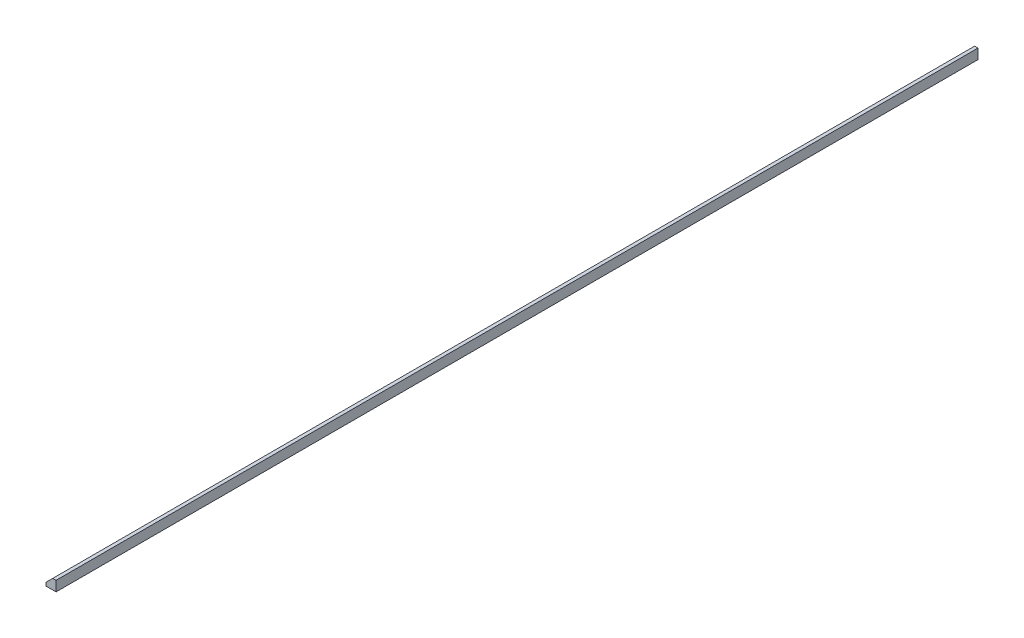
ISO-10303-21;
HEADER;
FILE_DESCRIPTION(('STEP AP214'),'2;1');
FILE_NAME('part.step','',(''),(''),'','','');
FILE_SCHEMA(('AUTOMOTIVE_DESIGN { 1 0 10303 214 1 1 1 1 }'));
ENDSEC;
DATA;
#1=APPLICATION_CONTEXT('core data for automotive mechanical design processes');
#2=APPLICATION_PROTOCOL_DEFINITION('international standard','automotive_design',2000,#1);
#3=PRODUCT_CONTEXT('',#1,'mechanical');
#4=PRODUCT('Part','Part','',(#3));
#5=PRODUCT_RELATED_PRODUCT_CATEGORY('part','',(#4));
#6=PRODUCT_DEFINITION_FORMATION('','',#4);
#7=PRODUCT_DEFINITION_CONTEXT('part definition',#1,'design');
#8=PRODUCT_DEFINITION('design','',#6,#7);
#9=PRODUCT_DEFINITION_SHAPE('','',#8);
#10=(LENGTH_UNIT() NAMED_UNIT(*) SI_UNIT(.MILLI.,.METRE.));
#11=(NAMED_UNIT(*) PLANE_ANGLE_UNIT() SI_UNIT($,.RADIAN.));
#12=(NAMED_UNIT(*) SI_UNIT($,.STERADIAN.) SOLID_ANGLE_UNIT());
#13=UNCERTAINTY_MEASURE_WITH_UNIT(LENGTH_MEASURE(1.E-05),#10,'distance_accuracy_value','');
#14=(GEOMETRIC_REPRESENTATION_CONTEXT(3) GLOBAL_UNCERTAINTY_ASSIGNED_CONTEXT((#13)) GLOBAL_UNIT_ASSIGNED_CONTEXT((#10,
#11,#12)) REPRESENTATION_CONTEXT('',''));
#15=CARTESIAN_POINT('',(0.,0.,0.));
#16=DIRECTION('',(0.,0.,1.));
#17=DIRECTION('',(1.,0.,0.));
#18=AXIS2_PLACEMENT_3D('',#15,#16,#17);
#19=CARTESIAN_POINT('',(0.,0.,1100.));
#20=DIRECTION('',(1.,0.,0.));
#21=DIRECTION('',(0.,0.,-1.));
#22=AXIS2_PLACEMENT_3D('',#19,#20,#21);
#23=PLANE('',#22);
#24=DIRECTION('',(0.,-1.,0.));
#25=VECTOR('',#24,1.);
#26=CARTESIAN_POINT('',(0.,0.,1100.));
#27=LINE('',#26,#25);
#28=CARTESIAN_POINT('',(0.,3.99999999999999,1100.));
#29=VERTEX_POINT('',#28);
#30=CARTESIAN_POINT('',(0.,0.,1100.));
#31=VERTEX_POINT('',#30);
#32=EDGE_CURVE('E79',#29,#31,#27,.T.);
#33=ORIENTED_EDGE('',*,*,#32,.F.);
#34=DIRECTION('',(0.,0.,-1.));
#35=VECTOR('',#34,1.);
#36=CARTESIAN_POINT('',(0.,3.99999999999999,1100.));
#37=LINE('',#36,#35);
#38=CARTESIAN_POINT('',(0.,3.99999999999999,0.));
#39=VERTEX_POINT('',#38);
#40=EDGE_CURVE('E102',#29,#39,#37,.T.);
#41=ORIENTED_EDGE('',*,*,#40,.T.);
#42=DIRECTION('',(0.,-1.,0.));
#43=VECTOR('',#42,1.);
#44=CARTESIAN_POINT('',(0.,0.,0.));
#45=LINE('',#44,#43);
#46=CARTESIAN_POINT('',(0.,0.,0.));
#47=VERTEX_POINT('',#46);
#48=EDGE_CURVE('E100',#39,#47,#45,.T.);
#49=ORIENTED_EDGE('',*,*,#48,.T.);
#50=DIRECTION('',(0.,0.,-1.));
#51=VECTOR('',#50,1.);
#52=CARTESIAN_POINT('',(0.,0.,1100.));
#53=LINE('',#52,#51);
#54=EDGE_CURVE('E94',#31,#47,#53,.T.);
#55=ORIENTED_EDGE('',*,*,#54,.F.);
#56=EDGE_LOOP('',(#33,#41,#49,#55));
#57=FACE_BOUND('',#56,.T.);
#58=ADVANCED_FACE('F33',(#57),#23,.F.);
#59=CARTESIAN_POINT('',(0.,0.,1100.));
#60=DIRECTION('',(0.,1.,0.));
#61=DIRECTION('',(0.,0.,1.));
#62=AXIS2_PLACEMENT_3D('',#59,#60,#61);
#63=PLANE('',#62);
#64=DIRECTION('',(1.,0.,0.));
#65=VECTOR('',#64,1.);
#66=CARTESIAN_POINT('',(0.,0.,0.));
#67=LINE('',#66,#65);
#68=CARTESIAN_POINT('',(12.,0.,0.));
#69=VERTEX_POINT('',#68);
#70=EDGE_CURVE('E115',#47,#69,#67,.T.);
#71=ORIENTED_EDGE('',*,*,#70,.T.);
#72=DIRECTION('',(0.,0.,-1.));
#73=VECTOR('',#72,1.);
#74=CARTESIAN_POINT('',(12.,0.,1100.));
#75=LINE('',#74,#73);
#76=CARTESIAN_POINT('',(12.,0.,1100.));
#77=VERTEX_POINT('',#76);
#78=EDGE_CURVE('E96',#77,#69,#75,.T.);
#79=ORIENTED_EDGE('',*,*,#78,.F.);
#80=DIRECTION('',(1.,0.,0.));
#81=VECTOR('',#80,1.);
#82=CARTESIAN_POINT('',(0.,0.,1100.));
#83=LINE('',#82,#81);
#84=EDGE_CURVE('E82',#31,#77,#83,.T.);
#85=ORIENTED_EDGE('',*,*,#84,.F.);
#86=ORIENTED_EDGE('',*,*,#54,.T.);
#87=EDGE_LOOP('',(#71,#79,#85,#86));
#88=FACE_BOUND('',#87,.T.);
#89=ADVANCED_FACE('F93',(#88),#63,.F.);
#90=CARTESIAN_POINT('',(12.,0.,1100.));
#91=DIRECTION('',(-1.,0.,0.));
#92=DIRECTION('',(0.,0.,1.));
#93=AXIS2_PLACEMENT_3D('',#90,#91,#92);
#94=PLANE('',#93);
#95=DIRECTION('',(0.,1.,0.));
#96=VECTOR('',#95,1.);
#97=CARTESIAN_POINT('',(12.,0.,0.));
#98=LINE('',#97,#96);
#99=CARTESIAN_POINT('',(12.,12.,0.));
#100=VERTEX_POINT('',#99);
#101=EDGE_CURVE('E113',#69,#100,#98,.T.);
#102=ORIENTED_EDGE('',*,*,#101,.T.);
#103=DIRECTION('',(0.,0.,-1.));
#104=VECTOR('',#103,1.);
#105=CARTESIAN_POINT('',(12.,12.,1100.));
#106=LINE('',#105,#104);
#107=CARTESIAN_POINT('',(12.,12.,1100.));
#108=VERTEX_POINT('',#107);
#109=EDGE_CURVE('E105',#108,#100,#106,.T.);
#110=ORIENTED_EDGE('',*,*,#109,.F.);
#111=DIRECTION('',(0.,1.,0.));
#112=VECTOR('',#111,1.);
#113=CARTESIAN_POINT('',(12.,0.,1100.));
#114=LINE('',#113,#112);
#115=EDGE_CURVE('E98',#77,#108,#114,.T.);
#116=ORIENTED_EDGE('',*,*,#115,.F.);
#117=ORIENTED_EDGE('',*,*,#78,.T.);
#118=EDGE_LOOP('',(#102,#110,#116,#117));
#119=FACE_BOUND('',#118,.T.);
#120=ADVANCED_FACE('F121',(#119),#94,.F.);
#121=CARTESIAN_POINT('',(0.,12.,1100.));
#122=DIRECTION('',(0.,-1.,0.));
#123=DIRECTION('',(0.,0.,-1.));
#124=AXIS2_PLACEMENT_3D('',#121,#122,#123);
#125=PLANE('',#124);
#126=DIRECTION('',(-1.,0.,0.));
#127=VECTOR('',#126,1.);
#128=CARTESIAN_POINT('',(0.,12.,0.));
#129=LINE('',#128,#127);
#130=CARTESIAN_POINT('',(8.00000000000001,12.,0.));
#131=VERTEX_POINT('',#130);
#132=EDGE_CURVE('E89',#100,#131,#129,.T.);
#133=ORIENTED_EDGE('',*,*,#132,.T.);
#134=DIRECTION('',(0.,0.,1.));
#135=VECTOR('',#134,1.);
#136=CARTESIAN_POINT('',(8.00000000000001,12.,1100.));
#137=LINE('',#136,#135);
#138=CARTESIAN_POINT('',(8.00000000000001,12.,1100.));
#139=VERTEX_POINT('',#138);
#140=EDGE_CURVE('E41',#131,#139,#137,.T.);
#141=ORIENTED_EDGE('',*,*,#140,.T.);
#142=DIRECTION('',(-1.,0.,0.));
#143=VECTOR('',#142,1.);
#144=CARTESIAN_POINT('',(0.,12.,1100.));
#145=LINE('',#144,#143);
#146=EDGE_CURVE('E111',#108,#139,#145,.T.);
#147=ORIENTED_EDGE('',*,*,#146,.F.);
#148=ORIENTED_EDGE('',*,*,#109,.T.);
#149=EDGE_LOOP('',(#133,#141,#147,#148));
#150=FACE_BOUND('',#149,.T.);
#151=ADVANCED_FACE('F123',(#150),#125,.F.);
#152=CARTESIAN_POINT('',(0.,0.,1100.));
#153=DIRECTION('',(0.,0.,-1.));
#154=DIRECTION('',(-1.,0.,0.));
#155=AXIS2_PLACEMENT_3D('',#152,#153,#154);
#156=PLANE('',#155);
#157=ORIENTED_EDGE('',*,*,#146,.T.);
#158=DIRECTION('',(0.707106781186548,0.707106781186548,0.));
#159=VECTOR('',#158,1.);
#160=CARTESIAN_POINT('',(0.,3.99999999999999,1100.));
#161=LINE('',#160,#159);
#162=EDGE_CURVE('E11',#139,#29,#161,.F.);
#163=ORIENTED_EDGE('',*,*,#162,.T.);
#164=ORIENTED_EDGE('',*,*,#32,.T.);
#165=ORIENTED_EDGE('',*,*,#84,.T.);
#166=ORIENTED_EDGE('',*,*,#115,.T.);
#167=EDGE_LOOP('',(#157,#163,#164,#165,#166));
#168=FACE_BOUND('',#167,.T.);
#169=ADVANCED_FACE('F81',(#168),#156,.F.);
#170=CARTESIAN_POINT('',(0.,0.,0.));
#171=DIRECTION('',(0.,0.,-1.));
#172=DIRECTION('',(-1.,0.,0.));
#173=AXIS2_PLACEMENT_3D('',#170,#171,#172);
#174=PLANE('',#173);
#175=ORIENTED_EDGE('',*,*,#48,.F.);
#176=DIRECTION('',(-0.707106781186548,-0.707106781186548,0.));
#177=VECTOR('',#176,1.);
#178=CARTESIAN_POINT('',(-2.,2.,0.));
#179=LINE('',#178,#177);
#180=EDGE_CURVE('E55',#39,#131,#179,.F.);
#181=ORIENTED_EDGE('',*,*,#180,.T.);
#182=ORIENTED_EDGE('',*,*,#132,.F.);
#183=ORIENTED_EDGE('',*,*,#101,.F.);
#184=ORIENTED_EDGE('',*,*,#70,.F.);
#185=EDGE_LOOP('',(#175,#181,#182,#183,#184));
#186=FACE_BOUND('',#185,.T.);
#187=ADVANCED_FACE('F130',(#186),#174,.T.);
#188=CARTESIAN_POINT('',(0.,3.99999999999999,1100.));
#189=DIRECTION('',(0.707106781186547,-0.707106781186547,0.));
#190=DIRECTION('',(0.,0.,-1.));
#191=AXIS2_PLACEMENT_3D('',#188,#189,#190);
#192=PLANE('',#191);
#193=ORIENTED_EDGE('',*,*,#162,.F.);
#194=ORIENTED_EDGE('',*,*,#140,.F.);
#195=ORIENTED_EDGE('',*,*,#180,.F.);
#196=ORIENTED_EDGE('',*,*,#40,.F.);
#197=EDGE_LOOP('',(#193,#194,#195,#196));
#198=FACE_BOUND('',#197,.T.);
#199=ADVANCED_FACE('F35',(#198),#192,.F.);
#200=CLOSED_SHELL('',(#58,#89,#120,#151,#169,#187,#199));
#201=MANIFOLD_SOLID_BREP('B2',#200);
#202=ADVANCED_BREP_SHAPE_REPRESENTATION('',(#18,#201),#14);
#203=SHAPE_DEFINITION_REPRESENTATION(#9,#202);
ENDSEC;
END-ISO-10303-21;
